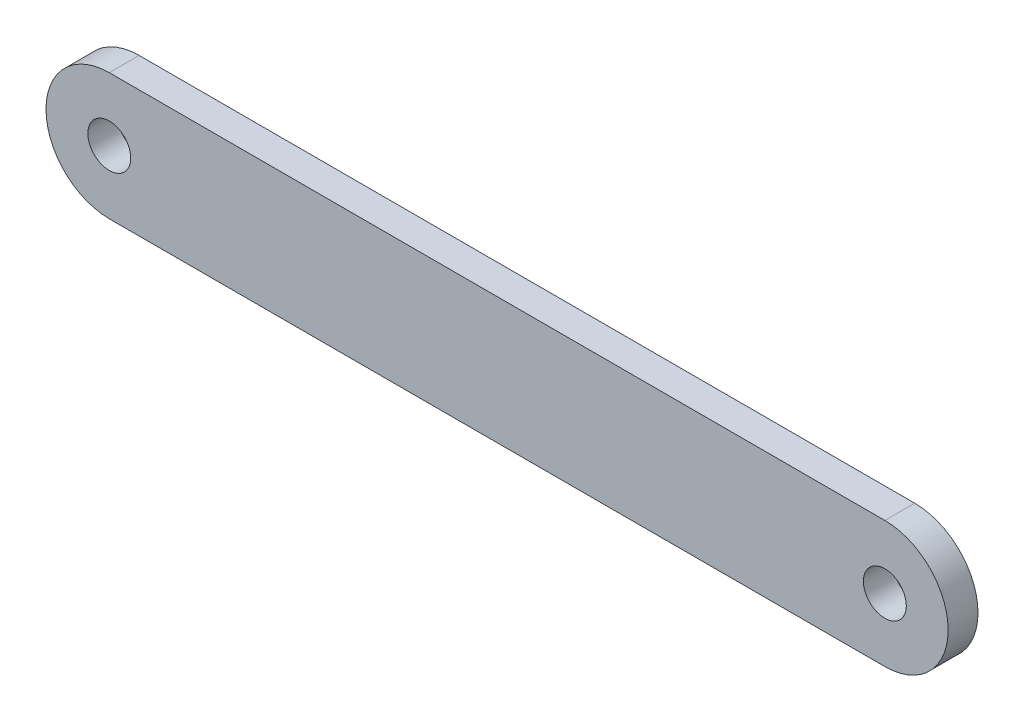
ISO-10303-21;
HEADER;
FILE_DESCRIPTION(('STEP AP214'),'2;1');
FILE_NAME('part.step','',(''),(''),'','','');
FILE_SCHEMA(('AUTOMOTIVE_DESIGN { 1 0 10303 214 1 1 1 1 }'));
ENDSEC;
DATA;
#1=APPLICATION_CONTEXT('core data for automotive mechanical design processes');
#2=APPLICATION_PROTOCOL_DEFINITION('international standard','automotive_design',2000,#1);
#3=PRODUCT_CONTEXT('',#1,'mechanical');
#4=PRODUCT('Part','Part','',(#3));
#5=PRODUCT_RELATED_PRODUCT_CATEGORY('part','',(#4));
#6=PRODUCT_DEFINITION_FORMATION('','',#4);
#7=PRODUCT_DEFINITION_CONTEXT('part definition',#1,'design');
#8=PRODUCT_DEFINITION('design','',#6,#7);
#9=PRODUCT_DEFINITION_SHAPE('','',#8);
#10=(LENGTH_UNIT() NAMED_UNIT(*) SI_UNIT(.MILLI.,.METRE.));
#11=(NAMED_UNIT(*) PLANE_ANGLE_UNIT() SI_UNIT($,.RADIAN.));
#12=(NAMED_UNIT(*) SI_UNIT($,.STERADIAN.) SOLID_ANGLE_UNIT());
#13=UNCERTAINTY_MEASURE_WITH_UNIT(LENGTH_MEASURE(1.E-05),#10,'distance_accuracy_value','');
#14=(GEOMETRIC_REPRESENTATION_CONTEXT(3) GLOBAL_UNCERTAINTY_ASSIGNED_CONTEXT((#13)) GLOBAL_UNIT_ASSIGNED_CONTEXT((#10,
#11,#12)) REPRESENTATION_CONTEXT('',''));
#15=CARTESIAN_POINT('',(0.,0.,0.));
#16=DIRECTION('',(0.,0.,1.));
#17=DIRECTION('',(1.,0.,0.));
#18=AXIS2_PLACEMENT_3D('',#15,#16,#17);
#19=CARTESIAN_POINT('',(-38.9128,0.,2.9972));
#20=DIRECTION('',(0.,0.,-1.));
#21=DIRECTION('',(-1.,0.,0.));
#22=AXIS2_PLACEMENT_3D('',#19,#20,#21);
#23=CYLINDRICAL_SURFACE('',#22,6.35);
#24=CARTESIAN_POINT('',(-38.9128,0.,0.));
#25=DIRECTION('',(0.,0.,1.));
#26=DIRECTION('',(1.,0.,0.));
#27=AXIS2_PLACEMENT_3D('',#24,#25,#26);
#28=CIRCLE('',#27,6.35);
#29=CARTESIAN_POINT('',(-38.9128,6.35,0.));
#30=VERTEX_POINT('',#29);
#31=CARTESIAN_POINT('',(-38.9128,-6.35,0.));
#32=VERTEX_POINT('',#31);
#33=EDGE_CURVE('E97',#30,#32,#28,.T.);
#34=ORIENTED_EDGE('',*,*,#33,.T.);
#35=DIRECTION('',(0.,0.,-1.));
#36=VECTOR('',#35,1.);
#37=CARTESIAN_POINT('',(-38.9128,-6.35,2.9972));
#38=LINE('',#37,#36);
#39=CARTESIAN_POINT('',(-38.9128,-6.35,2.9972));
#40=VERTEX_POINT('',#39);
#41=EDGE_CURVE('E11',#40,#32,#38,.T.);
#42=ORIENTED_EDGE('',*,*,#41,.F.);
#43=CARTESIAN_POINT('',(-38.9128,0.,2.9972));
#44=DIRECTION('',(0.,0.,1.));
#45=DIRECTION('',(1.,0.,0.));
#46=AXIS2_PLACEMENT_3D('',#43,#44,#45);
#47=CIRCLE('',#46,6.35);
#48=CARTESIAN_POINT('',(-38.9128,6.35,2.9972));
#49=VERTEX_POINT('',#48);
#50=EDGE_CURVE('E84',#49,#40,#47,.T.);
#51=ORIENTED_EDGE('',*,*,#50,.F.);
#52=DIRECTION('',(0.,0.,-1.));
#53=VECTOR('',#52,1.);
#54=CARTESIAN_POINT('',(-38.9128,6.35,2.9972));
#55=LINE('',#54,#53);
#56=EDGE_CURVE('E93',#49,#30,#55,.T.);
#57=ORIENTED_EDGE('',*,*,#56,.T.);
#58=EDGE_LOOP('',(#34,#42,#51,#57));
#59=FACE_BOUND('',#58,.T.);
#60=ADVANCED_FACE('F32',(#59),#23,.T.);
#61=CARTESIAN_POINT('',(-38.9128,-6.35,2.9972));
#62=DIRECTION('',(0.,1.,0.));
#63=DIRECTION('',(-1.,0.,0.));
#64=AXIS2_PLACEMENT_3D('',#61,#62,#63);
#65=PLANE('',#64);
#66=DIRECTION('',(1.,0.,0.));
#67=VECTOR('',#66,1.);
#68=CARTESIAN_POINT('',(-38.9128,-6.35,0.));
#69=LINE('',#68,#67);
#70=CARTESIAN_POINT('',(38.9128,-6.34999999999999,0.));
#71=VERTEX_POINT('',#70);
#72=EDGE_CURVE('E88',#32,#71,#69,.T.);
#73=ORIENTED_EDGE('',*,*,#72,.T.);
#74=DIRECTION('',(0.,0.,-1.));
#75=VECTOR('',#74,1.);
#76=CARTESIAN_POINT('',(38.9128,-6.34999999999999,2.9972));
#77=LINE('',#76,#75);
#78=CARTESIAN_POINT('',(38.9128,-6.34999999999999,2.9972));
#79=VERTEX_POINT('',#78);
#80=EDGE_CURVE('E41',#79,#71,#77,.T.);
#81=ORIENTED_EDGE('',*,*,#80,.F.);
#82=DIRECTION('',(1.,0.,0.));
#83=VECTOR('',#82,1.);
#84=CARTESIAN_POINT('',(-38.9128,-6.35,2.9972));
#85=LINE('',#84,#83);
#86=EDGE_CURVE('E79',#40,#79,#85,.T.);
#87=ORIENTED_EDGE('',*,*,#86,.F.);
#88=ORIENTED_EDGE('',*,*,#41,.T.);
#89=EDGE_LOOP('',(#73,#81,#87,#88));
#90=FACE_BOUND('',#89,.T.);
#91=ADVANCED_FACE('F87',(#90),#65,.F.);
#92=CARTESIAN_POINT('',(38.9128,0.,2.9972));
#93=DIRECTION('',(0.,0.,-1.));
#94=DIRECTION('',(-1.,0.,0.));
#95=AXIS2_PLACEMENT_3D('',#92,#93,#94);
#96=CYLINDRICAL_SURFACE('',#95,6.35);
#97=CARTESIAN_POINT('',(38.9128,0.,0.));
#98=DIRECTION('',(0.,0.,1.));
#99=DIRECTION('',(1.,0.,0.));
#100=AXIS2_PLACEMENT_3D('',#97,#98,#99);
#101=CIRCLE('',#100,6.35);
#102=CARTESIAN_POINT('',(38.9128,6.35000000000001,0.));
#103=VERTEX_POINT('',#102);
#104=EDGE_CURVE('E66',#71,#103,#101,.T.);
#105=ORIENTED_EDGE('',*,*,#104,.T.);
#106=DIRECTION('',(0.,0.,-1.));
#107=VECTOR('',#106,1.);
#108=CARTESIAN_POINT('',(38.9128,6.35000000000001,2.9972));
#109=LINE('',#108,#107);
#110=CARTESIAN_POINT('',(38.9128,6.35000000000001,2.9972));
#111=VERTEX_POINT('',#110);
#112=EDGE_CURVE('E89',#111,#103,#109,.T.);
#113=ORIENTED_EDGE('',*,*,#112,.F.);
#114=CARTESIAN_POINT('',(38.9128,0.,2.9972));
#115=DIRECTION('',(0.,0.,1.));
#116=DIRECTION('',(1.,0.,0.));
#117=AXIS2_PLACEMENT_3D('',#114,#115,#116);
#118=CIRCLE('',#117,6.35);
#119=EDGE_CURVE('E82',#79,#111,#118,.T.);
#120=ORIENTED_EDGE('',*,*,#119,.F.);
#121=ORIENTED_EDGE('',*,*,#80,.T.);
#122=EDGE_LOOP('',(#105,#113,#120,#121));
#123=FACE_BOUND('',#122,.T.);
#124=ADVANCED_FACE('F91',(#123),#96,.T.);
#125=CARTESIAN_POINT('',(-38.9128,6.35,2.9972));
#126=DIRECTION('',(0.,-1.,0.));
#127=DIRECTION('',(1.,0.,0.));
#128=AXIS2_PLACEMENT_3D('',#125,#126,#127);
#129=PLANE('',#128);
#130=DIRECTION('',(-1.,0.,0.));
#131=VECTOR('',#130,1.);
#132=CARTESIAN_POINT('',(-38.9128,6.35,0.));
#133=LINE('',#132,#131);
#134=EDGE_CURVE('E72',#103,#30,#133,.T.);
#135=ORIENTED_EDGE('',*,*,#134,.T.);
#136=ORIENTED_EDGE('',*,*,#56,.F.);
#137=DIRECTION('',(-1.,0.,0.));
#138=VECTOR('',#137,1.);
#139=CARTESIAN_POINT('',(-38.9128,6.35,2.9972));
#140=LINE('',#139,#138);
#141=EDGE_CURVE('E49',#111,#49,#140,.T.);
#142=ORIENTED_EDGE('',*,*,#141,.F.);
#143=ORIENTED_EDGE('',*,*,#112,.T.);
#144=EDGE_LOOP('',(#135,#136,#142,#143));
#145=FACE_BOUND('',#144,.T.);
#146=ADVANCED_FACE('F105',(#145),#129,.F.);
#147=CARTESIAN_POINT('',(-38.9128,0.,2.9972));
#148=DIRECTION('',(0.,0.,1.));
#149=DIRECTION('',(1.,0.,0.));
#150=AXIS2_PLACEMENT_3D('',#147,#148,#149);
#151=PLANE('',#150);
#152=CARTESIAN_POINT('',(-38.9128,0.,2.9972));
#153=DIRECTION('',(0.,0.,1.));
#154=DIRECTION('',(1.,0.,0.));
#155=AXIS2_PLACEMENT_3D('',#152,#153,#154);
#156=CIRCLE('',#155,2.15264999999999);
#157=CARTESIAN_POINT('',(-36.76015,0.,2.9972));
#158=VERTEX_POINT('',#157);
#159=EDGE_CURVE('E116',#158,#158,#156,.T.);
#160=ORIENTED_EDGE('',*,*,#159,.F.);
#161=EDGE_LOOP('',(#160));
#162=FACE_BOUND('',#161,.T.);
#163=CARTESIAN_POINT('',(38.9128,0.,2.9972));
#164=DIRECTION('',(0.,0.,1.));
#165=DIRECTION('',(1.,0.,0.));
#166=AXIS2_PLACEMENT_3D('',#163,#164,#165);
#167=CIRCLE('',#166,2.15264999999999);
#168=CARTESIAN_POINT('',(41.06545,0.,2.9972));
#169=VERTEX_POINT('',#168);
#170=EDGE_CURVE('E113',#169,#169,#167,.T.);
#171=ORIENTED_EDGE('',*,*,#170,.F.);
#172=EDGE_LOOP('',(#171));
#173=FACE_BOUND('',#172,.T.);
#174=ORIENTED_EDGE('',*,*,#50,.T.);
#175=ORIENTED_EDGE('',*,*,#86,.T.);
#176=ORIENTED_EDGE('',*,*,#119,.T.);
#177=ORIENTED_EDGE('',*,*,#141,.T.);
#178=EDGE_LOOP('',(#174,#175,#176,#177));
#179=FACE_BOUND('',#178,.T.);
#180=ADVANCED_FACE('F80',(#162,#173,#179),#151,.T.);
#181=CARTESIAN_POINT('',(-38.9128,0.,0.));
#182=DIRECTION('',(0.,0.,1.));
#183=DIRECTION('',(1.,0.,0.));
#184=AXIS2_PLACEMENT_3D('',#181,#182,#183);
#185=PLANE('',#184);
#186=CARTESIAN_POINT('',(-38.9128,0.,0.));
#187=DIRECTION('',(0.,0.,1.));
#188=DIRECTION('',(1.,0.,0.));
#189=AXIS2_PLACEMENT_3D('',#186,#187,#188);
#190=CIRCLE('',#189,2.15264999999999);
#191=CARTESIAN_POINT('',(-36.76015,0.,0.));
#192=VERTEX_POINT('',#191);
#193=EDGE_CURVE('E35',#192,#192,#190,.T.);
#194=ORIENTED_EDGE('',*,*,#193,.T.);
#195=EDGE_LOOP('',(#194));
#196=FACE_BOUND('',#195,.T.);
#197=CARTESIAN_POINT('',(38.9128,0.,0.));
#198=DIRECTION('',(0.,0.,1.));
#199=DIRECTION('',(1.,0.,0.));
#200=AXIS2_PLACEMENT_3D('',#197,#198,#199);
#201=CIRCLE('',#200,2.15264999999999);
#202=CARTESIAN_POINT('',(41.06545,0.,0.));
#203=VERTEX_POINT('',#202);
#204=EDGE_CURVE('E100',#203,#203,#201,.T.);
#205=ORIENTED_EDGE('',*,*,#204,.T.);
#206=EDGE_LOOP('',(#205));
#207=FACE_BOUND('',#206,.T.);
#208=ORIENTED_EDGE('',*,*,#33,.F.);
#209=ORIENTED_EDGE('',*,*,#134,.F.);
#210=ORIENTED_EDGE('',*,*,#104,.F.);
#211=ORIENTED_EDGE('',*,*,#72,.F.);
#212=EDGE_LOOP('',(#208,#209,#210,#211));
#213=FACE_BOUND('',#212,.T.);
#214=ADVANCED_FACE('F108',(#196,#207,#213),#185,.F.);
#215=CARTESIAN_POINT('',(38.9128,0.,2.9972));
#216=DIRECTION('',(0.,0.,1.));
#217=DIRECTION('',(1.,0.,0.));
#218=AXIS2_PLACEMENT_3D('',#215,#216,#217);
#219=CYLINDRICAL_SURFACE('',#218,2.15264999999999);
#220=ORIENTED_EDGE('',*,*,#170,.T.);
#221=EDGE_LOOP('',(#220));
#222=FACE_BOUND('',#221,.T.);
#223=ORIENTED_EDGE('',*,*,#204,.F.);
#224=EDGE_LOOP('',(#223));
#225=FACE_BOUND('',#224,.T.);
#226=ADVANCED_FACE('F127',(#222,#225),#219,.F.);
#227=CARTESIAN_POINT('',(-38.9128,0.,2.9972));
#228=DIRECTION('',(0.,0.,1.));
#229=DIRECTION('',(1.,0.,0.));
#230=AXIS2_PLACEMENT_3D('',#227,#228,#229);
#231=CYLINDRICAL_SURFACE('',#230,2.15264999999999);
#232=ORIENTED_EDGE('',*,*,#159,.T.);
#233=EDGE_LOOP('',(#232));
#234=FACE_BOUND('',#233,.T.);
#235=ORIENTED_EDGE('',*,*,#193,.F.);
#236=EDGE_LOOP('',(#235));
#237=FACE_BOUND('',#236,.T.);
#238=ADVANCED_FACE('F125',(#234,#237),#231,.F.);
#239=CLOSED_SHELL('',(#60,#91,#124,#146,#180,#214,#226,#238));
#240=MANIFOLD_SOLID_BREP('B2',#239);
#241=ADVANCED_BREP_SHAPE_REPRESENTATION('',(#18,#240),#14);
#242=SHAPE_DEFINITION_REPRESENTATION(#9,#241);
ENDSEC;
END-ISO-10303-21;
